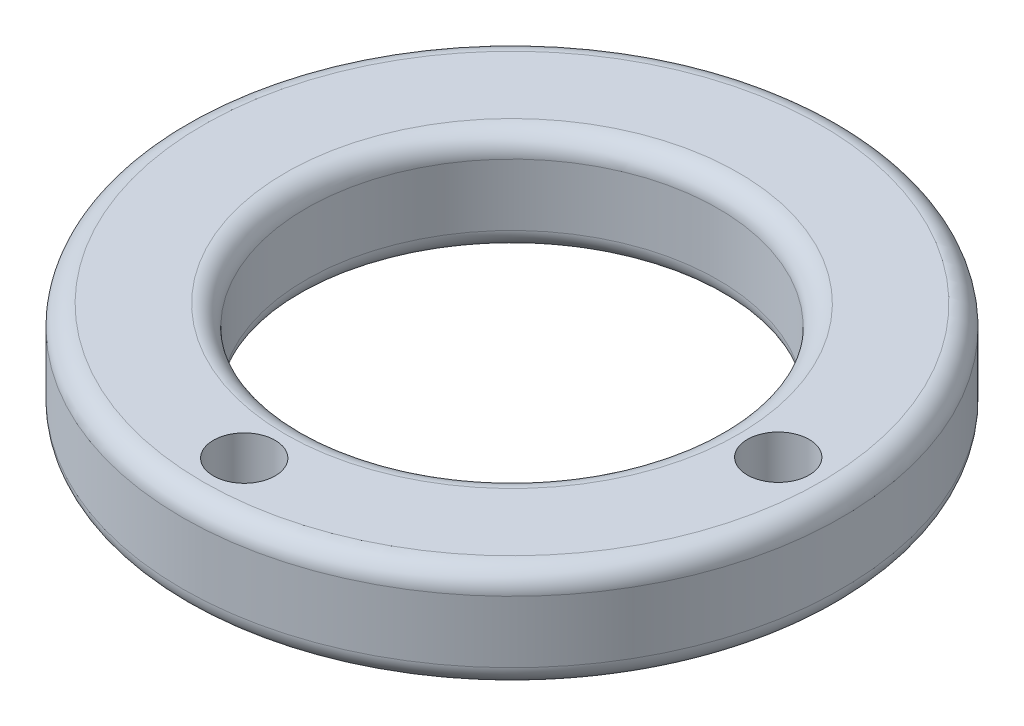
ISO-10303-21;
HEADER;
FILE_DESCRIPTION(('STEP AP214'),'2;1');
FILE_NAME('part.step','',(''),(''),'','','');
FILE_SCHEMA(('AUTOMOTIVE_DESIGN { 1 0 10303 214 1 1 1 1 }'));
ENDSEC;
DATA;
#1=APPLICATION_CONTEXT('core data for automotive mechanical design processes');
#2=APPLICATION_PROTOCOL_DEFINITION('international standard','automotive_design',2000,#1);
#3=PRODUCT_CONTEXT('',#1,'mechanical');
#4=PRODUCT('Part','Part','',(#3));
#5=PRODUCT_RELATED_PRODUCT_CATEGORY('part','',(#4));
#6=PRODUCT_DEFINITION_FORMATION('','',#4);
#7=PRODUCT_DEFINITION_CONTEXT('part definition',#1,'design');
#8=PRODUCT_DEFINITION('design','',#6,#7);
#9=PRODUCT_DEFINITION_SHAPE('','',#8);
#10=(LENGTH_UNIT() NAMED_UNIT(*) SI_UNIT(.MILLI.,.METRE.));
#11=(NAMED_UNIT(*) PLANE_ANGLE_UNIT() SI_UNIT($,.RADIAN.));
#12=(NAMED_UNIT(*) SI_UNIT($,.STERADIAN.) SOLID_ANGLE_UNIT());
#13=UNCERTAINTY_MEASURE_WITH_UNIT(LENGTH_MEASURE(1.E-05),#10,'distance_accuracy_value','');
#14=(GEOMETRIC_REPRESENTATION_CONTEXT(3) GLOBAL_UNCERTAINTY_ASSIGNED_CONTEXT((#13)) GLOBAL_UNIT_ASSIGNED_CONTEXT((#10,
#11,#12)) REPRESENTATION_CONTEXT('',''));
#15=CARTESIAN_POINT('',(0.,0.,0.));
#16=DIRECTION('',(0.,0.,1.));
#17=DIRECTION('',(1.,0.,0.));
#18=AXIS2_PLACEMENT_3D('',#15,#16,#17);
#19=CARTESIAN_POINT('',(0.,5.,0.));
#20=DIRECTION('',(0.,1.,0.));
#21=DIRECTION('',(0.,0.,1.));
#22=AXIS2_PLACEMENT_3D('',#19,#20,#21);
#23=PLANE('',#22);
#24=CARTESIAN_POINT('',(0.,5.,0.));
#25=DIRECTION('',(0.,1.,0.));
#26=DIRECTION('',(0.,0.,1.));
#27=AXIS2_PLACEMENT_3D('',#24,#25,#26);
#28=CIRCLE('',#27,15.);
#29=CARTESIAN_POINT('',(0.,5.,15.));
#30=VERTEX_POINT('',#29);
#31=EDGE_CURVE('E10',#30,#30,#28,.T.);
#32=ORIENTED_EDGE('',*,*,#31,.T.);
#33=EDGE_LOOP('',(#32));
#34=FACE_BOUND('',#33,.T.);
#35=CARTESIAN_POINT('',(0.,5.,0.));
#36=DIRECTION('',(0.,1.,0.));
#37=DIRECTION('',(0.,0.,1.));
#38=AXIS2_PLACEMENT_3D('',#35,#36,#37);
#39=CIRCLE('',#38,11.);
#40=CARTESIAN_POINT('',(0.,5.,11.));
#41=VERTEX_POINT('',#40);
#42=EDGE_CURVE('E40',#41,#41,#39,.F.);
#43=ORIENTED_EDGE('',*,*,#42,.T.);
#44=EDGE_LOOP('',(#43));
#45=FACE_BOUND('',#44,.T.);
#46=CARTESIAN_POINT('',(0.,5.,13.));
#47=DIRECTION('',(0.,1.,0.));
#48=DIRECTION('',(0.,0.,1.));
#49=AXIS2_PLACEMENT_3D('',#46,#47,#48);
#50=CIRCLE('',#49,1.5);
#51=CARTESIAN_POINT('',(0.,5.,14.5));
#52=VERTEX_POINT('',#51);
#53=EDGE_CURVE('E65',#52,#52,#50,.T.);
#54=ORIENTED_EDGE('',*,*,#53,.F.);
#55=EDGE_LOOP('',(#54));
#56=FACE_BOUND('',#55,.T.);
#57=CARTESIAN_POINT('',(12.9257765562668,5.,0.));
#58=DIRECTION('',(0.,1.,0.));
#59=DIRECTION('',(0.,0.,1.));
#60=AXIS2_PLACEMENT_3D('',#57,#58,#59);
#61=CIRCLE('',#60,1.5);
#62=CARTESIAN_POINT('',(12.9257765562668,5.,1.5));
#63=VERTEX_POINT('',#62);
#64=EDGE_CURVE('E69',#63,#63,#61,.T.);
#65=ORIENTED_EDGE('',*,*,#64,.F.);
#66=EDGE_LOOP('',(#65));
#67=FACE_BOUND('',#66,.T.);
#68=ADVANCED_FACE('F33',(#34,#45,#56,#67),#23,.T.);
#69=CARTESIAN_POINT('',(0.,0.,0.));
#70=DIRECTION('',(0.,1.,0.));
#71=DIRECTION('',(0.,0.,1.));
#72=AXIS2_PLACEMENT_3D('',#69,#70,#71);
#73=PLANE('',#72);
#74=CARTESIAN_POINT('',(0.,0.,0.));
#75=DIRECTION('',(0.,1.,0.));
#76=DIRECTION('',(0.,0.,1.));
#77=AXIS2_PLACEMENT_3D('',#74,#75,#76);
#78=CIRCLE('',#77,11.);
#79=CARTESIAN_POINT('',(0.,0.,11.));
#80=VERTEX_POINT('',#79);
#81=EDGE_CURVE('E59',#80,#80,#78,.T.);
#82=ORIENTED_EDGE('',*,*,#81,.T.);
#83=EDGE_LOOP('',(#82));
#84=FACE_BOUND('',#83,.T.);
#85=CARTESIAN_POINT('',(0.,0.,0.));
#86=DIRECTION('',(0.,1.,0.));
#87=DIRECTION('',(0.,0.,1.));
#88=AXIS2_PLACEMENT_3D('',#85,#86,#87);
#89=CIRCLE('',#88,15.);
#90=CARTESIAN_POINT('',(0.,0.,15.));
#91=VERTEX_POINT('',#90);
#92=EDGE_CURVE('E62',#91,#91,#89,.F.);
#93=ORIENTED_EDGE('',*,*,#92,.T.);
#94=EDGE_LOOP('',(#93));
#95=FACE_BOUND('',#94,.T.);
#96=CARTESIAN_POINT('',(0.,0.,13.));
#97=DIRECTION('',(0.,1.,0.));
#98=DIRECTION('',(0.,0.,1.));
#99=AXIS2_PLACEMENT_3D('',#96,#97,#98);
#100=CIRCLE('',#99,1.5);
#101=CARTESIAN_POINT('',(0.,0.,14.5));
#102=VERTEX_POINT('',#101);
#103=EDGE_CURVE('E66',#102,#102,#100,.T.);
#104=ORIENTED_EDGE('',*,*,#103,.T.);
#105=EDGE_LOOP('',(#104));
#106=FACE_BOUND('',#105,.T.);
#107=CARTESIAN_POINT('',(12.9257765562668,0.,0.));
#108=DIRECTION('',(0.,1.,0.));
#109=DIRECTION('',(0.,0.,1.));
#110=AXIS2_PLACEMENT_3D('',#107,#108,#109);
#111=CIRCLE('',#110,1.5);
#112=CARTESIAN_POINT('',(12.9257765562668,0.,1.5));
#113=VERTEX_POINT('',#112);
#114=EDGE_CURVE('E72',#113,#113,#111,.T.);
#115=ORIENTED_EDGE('',*,*,#114,.T.);
#116=EDGE_LOOP('',(#115));
#117=FACE_BOUND('',#116,.T.);
#118=ADVANCED_FACE('F82',(#84,#95,#106,#117),#73,.F.);
#119=CARTESIAN_POINT('',(0.,5.,0.));
#120=DIRECTION('',(0.,-1.,0.));
#121=DIRECTION('',(0.,0.,-1.));
#122=AXIS2_PLACEMENT_3D('',#119,#120,#121);
#123=CYLINDRICAL_SURFACE('',#122,16.);
#124=CARTESIAN_POINT('',(0.,1.,0.));
#125=DIRECTION('',(0.,1.,0.));
#126=DIRECTION('',(0.,0.,1.));
#127=AXIS2_PLACEMENT_3D('',#124,#125,#126);
#128=CIRCLE('',#127,16.);
#129=CARTESIAN_POINT('',(0.,1.,16.));
#130=VERTEX_POINT('',#129);
#131=EDGE_CURVE('E44',#130,#130,#128,.T.);
#132=ORIENTED_EDGE('',*,*,#131,.T.);
#133=EDGE_LOOP('',(#132));
#134=FACE_BOUND('',#133,.T.);
#135=CARTESIAN_POINT('',(0.,4.,0.));
#136=DIRECTION('',(0.,1.,0.));
#137=DIRECTION('',(0.,0.,1.));
#138=AXIS2_PLACEMENT_3D('',#135,#136,#137);
#139=CIRCLE('',#138,16.);
#140=CARTESIAN_POINT('',(0.,4.,16.));
#141=VERTEX_POINT('',#140);
#142=EDGE_CURVE('E48',#141,#141,#139,.F.);
#143=ORIENTED_EDGE('',*,*,#142,.T.);
#144=EDGE_LOOP('',(#143));
#145=FACE_BOUND('',#144,.T.);
#146=ADVANCED_FACE('F87',(#134,#145),#123,.T.);
#147=CARTESIAN_POINT('',(0.,5.,0.));
#148=DIRECTION('',(0.,-1.,0.));
#149=DIRECTION('',(0.,0.,-1.));
#150=AXIS2_PLACEMENT_3D('',#147,#148,#149);
#151=CYLINDRICAL_SURFACE('',#150,10.);
#152=CARTESIAN_POINT('',(0.,1.,0.));
#153=DIRECTION('',(0.,1.,0.));
#154=DIRECTION('',(0.,0.,1.));
#155=AXIS2_PLACEMENT_3D('',#152,#153,#154);
#156=CIRCLE('',#155,10.);
#157=CARTESIAN_POINT('',(0.,1.,10.));
#158=VERTEX_POINT('',#157);
#159=EDGE_CURVE('E53',#158,#158,#156,.F.);
#160=ORIENTED_EDGE('',*,*,#159,.T.);
#161=EDGE_LOOP('',(#160));
#162=FACE_BOUND('',#161,.T.);
#163=CARTESIAN_POINT('',(0.,4.,0.));
#164=DIRECTION('',(0.,1.,0.));
#165=DIRECTION('',(0.,0.,1.));
#166=AXIS2_PLACEMENT_3D('',#163,#164,#165);
#167=CIRCLE('',#166,10.);
#168=CARTESIAN_POINT('',(0.,4.,10.));
#169=VERTEX_POINT('',#168);
#170=EDGE_CURVE('E56',#169,#169,#167,.T.);
#171=ORIENTED_EDGE('',*,*,#170,.T.);
#172=EDGE_LOOP('',(#171));
#173=FACE_BOUND('',#172,.T.);
#174=ADVANCED_FACE('F91',(#162,#173),#151,.F.);
#175=CARTESIAN_POINT('',(0.,5.,13.));
#176=DIRECTION('',(0.,-1.,0.));
#177=DIRECTION('',(0.,0.,-1.));
#178=AXIS2_PLACEMENT_3D('',#175,#176,#177);
#179=CYLINDRICAL_SURFACE('',#178,1.5);
#180=ORIENTED_EDGE('',*,*,#53,.T.);
#181=EDGE_LOOP('',(#180));
#182=FACE_BOUND('',#181,.T.);
#183=ORIENTED_EDGE('',*,*,#103,.F.);
#184=EDGE_LOOP('',(#183));
#185=FACE_BOUND('',#184,.T.);
#186=ADVANCED_FACE('F120',(#182,#185),#179,.F.);
#187=CARTESIAN_POINT('',(12.9257765562668,5.,0.));
#188=DIRECTION('',(0.,-1.,0.));
#189=DIRECTION('',(0.,0.,-1.));
#190=AXIS2_PLACEMENT_3D('',#187,#188,#189);
#191=CYLINDRICAL_SURFACE('',#190,1.5);
#192=ORIENTED_EDGE('',*,*,#64,.T.);
#193=EDGE_LOOP('',(#192));
#194=FACE_BOUND('',#193,.T.);
#195=ORIENTED_EDGE('',*,*,#114,.F.);
#196=EDGE_LOOP('',(#195));
#197=FACE_BOUND('',#196,.T.);
#198=ADVANCED_FACE('F78',(#194,#197),#191,.F.);
#199=CARTESIAN_POINT('',(0.,1.,0.));
#200=DIRECTION('',(0.,1.,0.));
#201=DIRECTION('',(0.,0.,1.));
#202=AXIS2_PLACEMENT_3D('',#199,#200,#201);
#203=TOROIDAL_SURFACE('',#202,11.,1.);
#204=ORIENTED_EDGE('',*,*,#159,.F.);
#205=EDGE_LOOP('',(#204));
#206=FACE_BOUND('',#205,.T.);
#207=ORIENTED_EDGE('',*,*,#81,.F.);
#208=EDGE_LOOP('',(#207));
#209=FACE_BOUND('',#208,.T.);
#210=ADVANCED_FACE('F97',(#206,#209),#203,.T.);
#211=CARTESIAN_POINT('',(0.,1.,0.));
#212=DIRECTION('',(0.,1.,0.));
#213=DIRECTION('',(0.,0.,1.));
#214=AXIS2_PLACEMENT_3D('',#211,#212,#213);
#215=TOROIDAL_SURFACE('',#214,15.,1.);
#216=ORIENTED_EDGE('',*,*,#92,.F.);
#217=EDGE_LOOP('',(#216));
#218=FACE_BOUND('',#217,.T.);
#219=ORIENTED_EDGE('',*,*,#131,.F.);
#220=EDGE_LOOP('',(#219));
#221=FACE_BOUND('',#220,.T.);
#222=ADVANCED_FACE('F100',(#218,#221),#215,.T.);
#223=CARTESIAN_POINT('',(0.,4.,0.));
#224=DIRECTION('',(0.,1.,0.));
#225=DIRECTION('',(0.,0.,1.));
#226=AXIS2_PLACEMENT_3D('',#223,#224,#225);
#227=TOROIDAL_SURFACE('',#226,15.,1.);
#228=ORIENTED_EDGE('',*,*,#142,.F.);
#229=EDGE_LOOP('',(#228));
#230=FACE_BOUND('',#229,.T.);
#231=ORIENTED_EDGE('',*,*,#31,.F.);
#232=EDGE_LOOP('',(#231));
#233=FACE_BOUND('',#232,.T.);
#234=ADVANCED_FACE('F103',(#230,#233),#227,.T.);
#235=CARTESIAN_POINT('',(0.,4.,0.));
#236=DIRECTION('',(0.,1.,0.));
#237=DIRECTION('',(0.,0.,1.));
#238=AXIS2_PLACEMENT_3D('',#235,#236,#237);
#239=TOROIDAL_SURFACE('',#238,11.,1.);
#240=ORIENTED_EDGE('',*,*,#42,.F.);
#241=EDGE_LOOP('',(#240));
#242=FACE_BOUND('',#241,.T.);
#243=ORIENTED_EDGE('',*,*,#170,.F.);
#244=EDGE_LOOP('',(#243));
#245=FACE_BOUND('',#244,.T.);
#246=ADVANCED_FACE('F35',(#242,#245),#239,.T.);
#247=CLOSED_SHELL('',(#68,#118,#146,#174,#186,#198,#210,#222,#234,#246));
#248=MANIFOLD_SOLID_BREP('B2',#247);
#249=ADVANCED_BREP_SHAPE_REPRESENTATION('',(#18,#248),#14);
#250=SHAPE_DEFINITION_REPRESENTATION(#9,#249);
ENDSEC;
END-ISO-10303-21;
